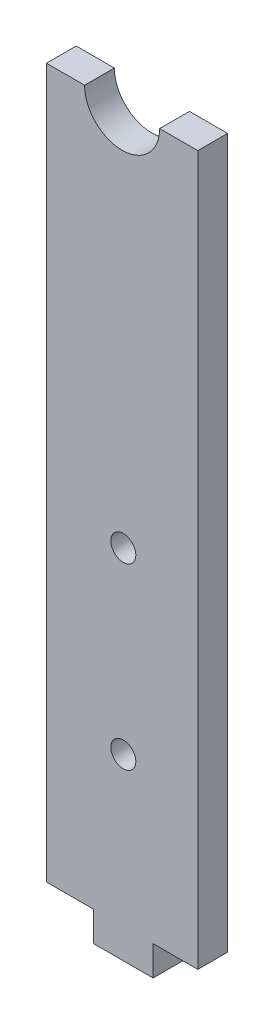
ISO-10303-21;
HEADER;
FILE_DESCRIPTION(('STEP AP214'),'2;1');
FILE_NAME('part.step','',(''),(''),'','','');
FILE_SCHEMA(('AUTOMOTIVE_DESIGN { 1 0 10303 214 1 1 1 1 }'));
ENDSEC;
DATA;
#1=APPLICATION_CONTEXT('core data for automotive mechanical design processes');
#2=APPLICATION_PROTOCOL_DEFINITION('international standard','automotive_design',2000,#1);
#3=PRODUCT_CONTEXT('',#1,'mechanical');
#4=PRODUCT('Part','Part','',(#3));
#5=PRODUCT_RELATED_PRODUCT_CATEGORY('part','',(#4));
#6=PRODUCT_DEFINITION_FORMATION('','',#4);
#7=PRODUCT_DEFINITION_CONTEXT('part definition',#1,'design');
#8=PRODUCT_DEFINITION('design','',#6,#7);
#9=PRODUCT_DEFINITION_SHAPE('','',#8);
#10=(LENGTH_UNIT() NAMED_UNIT(*) SI_UNIT(.MILLI.,.METRE.));
#11=(NAMED_UNIT(*) PLANE_ANGLE_UNIT() SI_UNIT($,.RADIAN.));
#12=(NAMED_UNIT(*) SI_UNIT($,.STERADIAN.) SOLID_ANGLE_UNIT());
#13=UNCERTAINTY_MEASURE_WITH_UNIT(LENGTH_MEASURE(1.E-05),#10,'distance_accuracy_value','');
#14=(GEOMETRIC_REPRESENTATION_CONTEXT(3) GLOBAL_UNCERTAINTY_ASSIGNED_CONTEXT((#13)) GLOBAL_UNIT_ASSIGNED_CONTEXT((#10,
#11,#12)) REPRESENTATION_CONTEXT('',''));
#15=CARTESIAN_POINT('',(0.,0.,0.));
#16=DIRECTION('',(0.,0.,1.));
#17=DIRECTION('',(1.,0.,0.));
#18=AXIS2_PLACEMENT_3D('',#15,#16,#17);
#19=CARTESIAN_POINT('',(-37.6912125425898,13.9321090895539,5.));
#20=DIRECTION('',(0.,-1.,0.));
#21=DIRECTION('',(0.,0.,-1.));
#22=AXIS2_PLACEMENT_3D('',#19,#20,#21);
#23=PLANE('',#22);
#24=DIRECTION('',(-1.,0.,0.));
#25=VECTOR('',#24,1.);
#26=CARTESIAN_POINT('',(-37.6912125425898,13.9321090895539,5.));
#27=LINE('',#26,#25);
#28=CARTESIAN_POINT('',(-31.2912125425898,13.9321090895539,5.));
#29=VERTEX_POINT('',#28);
#30=CARTESIAN_POINT('',(-37.6912125425898,13.9321090895539,5.));
#31=VERTEX_POINT('',#30);
#32=EDGE_CURVE('E134',#29,#31,#27,.T.);
#33=ORIENTED_EDGE('',*,*,#32,.F.);
#34=DIRECTION('',(0.,0.,-1.));
#35=VECTOR('',#34,1.);
#36=CARTESIAN_POINT('',(-31.2912125425898,13.9321090895539,10.));
#37=LINE('',#36,#35);
#38=CARTESIAN_POINT('',(-31.2912125425898,13.9321090895539,0.));
#39=VERTEX_POINT('',#38);
#40=EDGE_CURVE('E121',#29,#39,#37,.T.);
#41=ORIENTED_EDGE('',*,*,#40,.T.);
#42=DIRECTION('',(-1.,0.,0.));
#43=VECTOR('',#42,1.);
#44=CARTESIAN_POINT('',(-37.6912125425898,13.9321090895539,0.));
#45=LINE('',#44,#43);
#46=CARTESIAN_POINT('',(-37.6912125425898,13.9321090895539,0.));
#47=VERTEX_POINT('',#46);
#48=EDGE_CURVE('E132',#39,#47,#45,.T.);
#49=ORIENTED_EDGE('',*,*,#48,.T.);
#50=DIRECTION('',(0.,0.,-1.));
#51=VECTOR('',#50,1.);
#52=CARTESIAN_POINT('',(-37.6912125425898,13.9321090895539,5.));
#53=LINE('',#52,#51);
#54=EDGE_CURVE('E50',#31,#47,#53,.T.);
#55=ORIENTED_EDGE('',*,*,#54,.F.);
#56=EDGE_LOOP('',(#33,#41,#49,#55));
#57=FACE_BOUND('',#56,.T.);
#58=ADVANCED_FACE('F40',(#57),#23,.F.);
#59=CARTESIAN_POINT('',(-37.6912125425898,13.9321090895539,5.));
#60=DIRECTION('',(1.,0.,0.));
#61=DIRECTION('',(0.,1.,0.));
#62=AXIS2_PLACEMENT_3D('',#59,#60,#61);
#63=PLANE('',#62);
#64=DIRECTION('',(0.,-1.,0.));
#65=VECTOR('',#64,1.);
#66=CARTESIAN_POINT('',(-37.6912125425898,13.9321090895539,0.));
#67=LINE('',#66,#65);
#68=CARTESIAN_POINT('',(-37.6912125425898,-105.067890910446,0.));
#69=VERTEX_POINT('',#68);
#70=EDGE_CURVE('E141',#47,#69,#67,.T.);
#71=ORIENTED_EDGE('',*,*,#70,.T.);
#72=DIRECTION('',(0.,0.,-1.));
#73=VECTOR('',#72,1.);
#74=CARTESIAN_POINT('',(-37.6912125425898,-105.067890910446,10.));
#75=LINE('',#74,#73);
#76=CARTESIAN_POINT('',(-37.6912125425898,-105.067890910446,5.));
#77=VERTEX_POINT('',#76);
#78=EDGE_CURVE('E234',#77,#69,#75,.T.);
#79=ORIENTED_EDGE('',*,*,#78,.F.);
#80=DIRECTION('',(0.,-1.,0.));
#81=VECTOR('',#80,1.);
#82=CARTESIAN_POINT('',(-37.6912125425898,13.9321090895539,5.));
#83=LINE('',#82,#81);
#84=EDGE_CURVE('E149',#31,#77,#83,.T.);
#85=ORIENTED_EDGE('',*,*,#84,.F.);
#86=ORIENTED_EDGE('',*,*,#54,.T.);
#87=EDGE_LOOP('',(#71,#79,#85,#86));
#88=FACE_BOUND('',#87,.T.);
#89=ADVANCED_FACE('F42',(#88),#63,.F.);
#90=CARTESIAN_POINT('',(-37.6912125425898,-110.067890910446,5.));
#91=DIRECTION('',(0.,1.,0.));
#92=DIRECTION('',(0.,0.,1.));
#93=AXIS2_PLACEMENT_3D('',#90,#91,#92);
#94=PLANE('',#93);
#95=DIRECTION('',(1.,0.,0.));
#96=VECTOR('',#95,1.);
#97=CARTESIAN_POINT('',(-37.6912125425898,-110.067890910446,0.));
#98=LINE('',#97,#96);
#99=CARTESIAN_POINT('',(-29.7912125425898,-110.067890910446,0.));
#100=VERTEX_POINT('',#99);
#101=CARTESIAN_POINT('',(-19.7912125425898,-110.067890910446,0.));
#102=VERTEX_POINT('',#101);
#103=EDGE_CURVE('E151',#100,#102,#98,.T.);
#104=ORIENTED_EDGE('',*,*,#103,.T.);
#105=DIRECTION('',(0.,0.,-1.));
#106=VECTOR('',#105,1.);
#107=CARTESIAN_POINT('',(-19.7912125425898,-110.067890910446,10.));
#108=LINE('',#107,#106);
#109=CARTESIAN_POINT('',(-19.7912125425898,-110.067890910446,5.));
#110=VERTEX_POINT('',#109);
#111=EDGE_CURVE('E66',#110,#102,#108,.T.);
#112=ORIENTED_EDGE('',*,*,#111,.F.);
#113=DIRECTION('',(1.,0.,0.));
#114=VECTOR('',#113,1.);
#115=CARTESIAN_POINT('',(-37.6912125425898,-110.067890910446,5.));
#116=LINE('',#115,#114);
#117=CARTESIAN_POINT('',(-29.7912125425898,-110.067890910446,5.));
#118=VERTEX_POINT('',#117);
#119=EDGE_CURVE('E181',#118,#110,#116,.T.);
#120=ORIENTED_EDGE('',*,*,#119,.F.);
#121=DIRECTION('',(0.,0.,-1.));
#122=VECTOR('',#121,1.);
#123=CARTESIAN_POINT('',(-29.7912125425898,-110.067890910446,10.));
#124=LINE('',#123,#122);
#125=EDGE_CURVE('E200',#118,#100,#124,.T.);
#126=ORIENTED_EDGE('',*,*,#125,.T.);
#127=EDGE_LOOP('',(#104,#112,#120,#126));
#128=FACE_BOUND('',#127,.T.);
#129=ADVANCED_FACE('F198',(#128),#94,.F.);
#130=CARTESIAN_POINT('',(-12.2912125425898,13.9321090895539,5.));
#131=DIRECTION('',(-1.,0.,0.));
#132=DIRECTION('',(0.,-1.,0.));
#133=AXIS2_PLACEMENT_3D('',#130,#131,#132);
#134=PLANE('',#133);
#135=DIRECTION('',(0.,1.,0.));
#136=VECTOR('',#135,1.);
#137=CARTESIAN_POINT('',(-12.2912125425898,13.9321090895539,5.));
#138=LINE('',#137,#136);
#139=CARTESIAN_POINT('',(-12.2912125425898,-105.067890910446,5.));
#140=VERTEX_POINT('',#139);
#141=CARTESIAN_POINT('',(-12.2912125425898,13.9321090895539,5.));
#142=VERTEX_POINT('',#141);
#143=EDGE_CURVE('E185',#140,#142,#138,.T.);
#144=ORIENTED_EDGE('',*,*,#143,.F.);
#145=DIRECTION('',(0.,0.,-1.));
#146=VECTOR('',#145,1.);
#147=CARTESIAN_POINT('',(-12.2912125425898,-105.067890910446,10.));
#148=LINE('',#147,#146);
#149=CARTESIAN_POINT('',(-12.2912125425898,-105.067890910446,0.));
#150=VERTEX_POINT('',#149);
#151=EDGE_CURVE('E220',#140,#150,#148,.T.);
#152=ORIENTED_EDGE('',*,*,#151,.T.);
#153=DIRECTION('',(0.,1.,0.));
#154=VECTOR('',#153,1.);
#155=CARTESIAN_POINT('',(-12.2912125425898,13.9321090895539,0.));
#156=LINE('',#155,#154);
#157=CARTESIAN_POINT('',(-12.2912125425898,13.9321090895539,0.));
#158=VERTEX_POINT('',#157);
#159=EDGE_CURVE('E144',#150,#158,#156,.T.);
#160=ORIENTED_EDGE('',*,*,#159,.T.);
#161=DIRECTION('',(0.,0.,-1.));
#162=VECTOR('',#161,1.);
#163=CARTESIAN_POINT('',(-12.2912125425898,13.9321090895539,5.));
#164=LINE('',#163,#162);
#165=EDGE_CURVE('E11',#142,#158,#164,.T.);
#166=ORIENTED_EDGE('',*,*,#165,.F.);
#167=EDGE_LOOP('',(#144,#152,#160,#166));
#168=FACE_BOUND('',#167,.T.);
#169=ADVANCED_FACE('F271',(#168),#134,.F.);
#170=CARTESIAN_POINT('',(-18.6912125425898,13.9321090895539,0.));
#171=VERTEX_POINT('',#170);
#172=EDGE_CURVE('E143',#158,#171,#45,.T.);
#173=ORIENTED_EDGE('',*,*,#172,.T.);
#174=DIRECTION('',(0.,0.,-1.));
#175=VECTOR('',#174,1.);
#176=CARTESIAN_POINT('',(-18.6912125425898,13.9321090895539,10.));
#177=LINE('',#176,#175);
#178=CARTESIAN_POINT('',(-18.6912125425898,13.9321090895539,5.));
#179=VERTEX_POINT('',#178);
#180=EDGE_CURVE('E58',#179,#171,#177,.T.);
#181=ORIENTED_EDGE('',*,*,#180,.F.);
#182=EDGE_CURVE('E156',#142,#179,#27,.T.);
#183=ORIENTED_EDGE('',*,*,#182,.F.);
#184=ORIENTED_EDGE('',*,*,#165,.T.);
#185=EDGE_LOOP('',(#173,#181,#183,#184));
#186=FACE_BOUND('',#185,.T.);
#187=ADVANCED_FACE('F268',(#186),#23,.F.);
#188=CARTESIAN_POINT('',(0.,0.,5.));
#189=DIRECTION('',(0.,0.,1.));
#190=DIRECTION('',(1.,0.,0.));
#191=AXIS2_PLACEMENT_3D('',#188,#189,#190);
#192=PLANE('',#191);
#193=CARTESIAN_POINT('',(-24.9912125425898,13.9321090895539,5.));
#194=DIRECTION('',(0.,0.,1.));
#195=DIRECTION('',(1.,0.,0.));
#196=AXIS2_PLACEMENT_3D('',#193,#194,#195);
#197=CIRCLE('',#196,6.3);
#198=EDGE_CURVE('E218',#29,#179,#197,.T.);
#199=ORIENTED_EDGE('',*,*,#198,.F.);
#200=ORIENTED_EDGE('',*,*,#32,.T.);
#201=ORIENTED_EDGE('',*,*,#84,.T.);
#202=DIRECTION('',(-1.,0.,0.));
#203=VECTOR('',#202,1.);
#204=CARTESIAN_POINT('',(0.,-105.067890910446,5.));
#205=LINE('',#204,#203);
#206=CARTESIAN_POINT('',(-29.7912125425898,-105.067890910446,5.));
#207=VERTEX_POINT('',#206);
#208=EDGE_CURVE('E223',#207,#77,#205,.T.);
#209=ORIENTED_EDGE('',*,*,#208,.F.);
#210=DIRECTION('',(0.,1.,0.));
#211=VECTOR('',#210,1.);
#212=CARTESIAN_POINT('',(-29.7912125425898,0.,5.));
#213=LINE('',#212,#211);
#214=EDGE_CURVE('E241',#118,#207,#213,.T.);
#215=ORIENTED_EDGE('',*,*,#214,.F.);
#216=ORIENTED_EDGE('',*,*,#119,.T.);
#217=DIRECTION('',(0.,-1.,0.));
#218=VECTOR('',#217,1.);
#219=CARTESIAN_POINT('',(-19.7912125425898,0.,5.));
#220=LINE('',#219,#218);
#221=CARTESIAN_POINT('',(-19.7912125425898,-105.067890910446,5.));
#222=VERTEX_POINT('',#221);
#223=EDGE_CURVE('E243',#222,#110,#220,.T.);
#224=ORIENTED_EDGE('',*,*,#223,.F.);
#225=DIRECTION('',(-1.,0.,0.));
#226=VECTOR('',#225,1.);
#227=CARTESIAN_POINT('',(0.,-105.067890910446,5.));
#228=LINE('',#227,#226);
#229=EDGE_CURVE('E173',#140,#222,#228,.T.);
#230=ORIENTED_EDGE('',*,*,#229,.F.);
#231=ORIENTED_EDGE('',*,*,#143,.T.);
#232=ORIENTED_EDGE('',*,*,#182,.T.);
#233=EDGE_LOOP('',(#199,#200,#201,#209,#215,#216,#224,#230,#231,#232));
#234=FACE_BOUND('',#233,.T.);
#235=CARTESIAN_POINT('',(-24.7912125425898,-50.0678909104461,5.));
#236=DIRECTION('',(0.,0.,1.));
#237=DIRECTION('',(1.,0.,0.));
#238=AXIS2_PLACEMENT_3D('',#235,#236,#237);
#239=CIRCLE('',#238,2.1);
#240=CARTESIAN_POINT('',(-22.6912125425898,-50.0678909104461,5.));
#241=VERTEX_POINT('',#240);
#242=EDGE_CURVE('E159',#241,#241,#239,.T.);
#243=ORIENTED_EDGE('',*,*,#242,.F.);
#244=EDGE_LOOP('',(#243));
#245=FACE_BOUND('',#244,.T.);
#246=CARTESIAN_POINT('',(-24.7912125425898,-80.0678909104461,5.));
#247=DIRECTION('',(0.,0.,1.));
#248=DIRECTION('',(1.,0.,0.));
#249=AXIS2_PLACEMENT_3D('',#246,#247,#248);
#250=CIRCLE('',#249,2.1);
#251=CARTESIAN_POINT('',(-22.6912125425898,-80.0678909104461,5.));
#252=VERTEX_POINT('',#251);
#253=EDGE_CURVE('E166',#252,#252,#250,.T.);
#254=ORIENTED_EDGE('',*,*,#253,.F.);
#255=EDGE_LOOP('',(#254));
#256=FACE_BOUND('',#255,.T.);
#257=ADVANCED_FACE('F252',(#234,#245,#256),#192,.T.);
#258=CARTESIAN_POINT('',(0.,0.,0.));
#259=DIRECTION('',(0.,0.,1.));
#260=DIRECTION('',(1.,0.,0.));
#261=AXIS2_PLACEMENT_3D('',#258,#259,#260);
#262=PLANE('',#261);
#263=CARTESIAN_POINT('',(-24.7912125425898,-50.0678909104461,0.));
#264=DIRECTION('',(0.,0.,1.));
#265=DIRECTION('',(1.,0.,0.));
#266=AXIS2_PLACEMENT_3D('',#263,#264,#265);
#267=CIRCLE('',#266,2.1);
#268=CARTESIAN_POINT('',(-22.6912125425898,-50.0678909104461,0.));
#269=VERTEX_POINT('',#268);
#270=EDGE_CURVE('E44',#269,#269,#267,.T.);
#271=ORIENTED_EDGE('',*,*,#270,.T.);
#272=EDGE_LOOP('',(#271));
#273=FACE_BOUND('',#272,.T.);
#274=CARTESIAN_POINT('',(-24.7912125425898,-80.0678909104461,0.));
#275=DIRECTION('',(0.,0.,1.));
#276=DIRECTION('',(1.,0.,0.));
#277=AXIS2_PLACEMENT_3D('',#274,#275,#276);
#278=CIRCLE('',#277,2.1);
#279=CARTESIAN_POINT('',(-22.6912125425898,-80.0678909104461,0.));
#280=VERTEX_POINT('',#279);
#281=EDGE_CURVE('E157',#280,#280,#278,.T.);
#282=ORIENTED_EDGE('',*,*,#281,.T.);
#283=EDGE_LOOP('',(#282));
#284=FACE_BOUND('',#283,.T.);
#285=ORIENTED_EDGE('',*,*,#48,.F.);
#286=CARTESIAN_POINT('',(-24.9912125425898,13.9321090895539,0.));
#287=DIRECTION('',(0.,0.,-1.));
#288=DIRECTION('',(1.,0.,0.));
#289=AXIS2_PLACEMENT_3D('',#286,#287,#288);
#290=CIRCLE('',#289,6.3);
#291=EDGE_CURVE('E118',#171,#39,#290,.T.);
#292=ORIENTED_EDGE('',*,*,#291,.F.);
#293=ORIENTED_EDGE('',*,*,#172,.F.);
#294=ORIENTED_EDGE('',*,*,#159,.F.);
#295=DIRECTION('',(1.,0.,0.));
#296=VECTOR('',#295,1.);
#297=CARTESIAN_POINT('',(-12.2912125425898,-105.067890910446,0.));
#298=LINE('',#297,#296);
#299=CARTESIAN_POINT('',(-19.7912125425898,-105.067890910446,0.));
#300=VERTEX_POINT('',#299);
#301=EDGE_CURVE('E206',#300,#150,#298,.T.);
#302=ORIENTED_EDGE('',*,*,#301,.F.);
#303=DIRECTION('',(0.,1.,0.));
#304=VECTOR('',#303,1.);
#305=CARTESIAN_POINT('',(-19.7912125425898,-110.067890910446,0.));
#306=LINE('',#305,#304);
#307=EDGE_CURVE('E204',#102,#300,#306,.T.);
#308=ORIENTED_EDGE('',*,*,#307,.F.);
#309=ORIENTED_EDGE('',*,*,#103,.F.);
#310=DIRECTION('',(0.,-1.,0.));
#311=VECTOR('',#310,1.);
#312=CARTESIAN_POINT('',(-29.7912125425898,-110.067890910446,0.));
#313=LINE('',#312,#311);
#314=CARTESIAN_POINT('',(-29.7912125425898,-105.067890910446,0.));
#315=VERTEX_POINT('',#314);
#316=EDGE_CURVE('E202',#315,#100,#313,.T.);
#317=ORIENTED_EDGE('',*,*,#316,.F.);
#318=DIRECTION('',(1.,0.,0.));
#319=VECTOR('',#318,1.);
#320=CARTESIAN_POINT('',(-37.6912125425898,-105.067890910446,0.));
#321=LINE('',#320,#319);
#322=EDGE_CURVE('E229',#69,#315,#321,.T.);
#323=ORIENTED_EDGE('',*,*,#322,.F.);
#324=ORIENTED_EDGE('',*,*,#70,.F.);
#325=EDGE_LOOP('',(#285,#292,#293,#294,#302,#308,#309,#317,#323,#324));
#326=FACE_BOUND('',#325,.T.);
#327=ADVANCED_FACE('F138',(#273,#284,#326),#262,.F.);
#328=CARTESIAN_POINT('',(-24.7912125425898,-80.0678909104461,-30.));
#329=DIRECTION('',(0.,0.,1.));
#330=DIRECTION('',(1.,0.,0.));
#331=AXIS2_PLACEMENT_3D('',#328,#329,#330);
#332=CYLINDRICAL_SURFACE('',#331,2.1);
#333=ORIENTED_EDGE('',*,*,#253,.T.);
#334=EDGE_LOOP('',(#333));
#335=FACE_BOUND('',#334,.T.);
#336=ORIENTED_EDGE('',*,*,#281,.F.);
#337=EDGE_LOOP('',(#336));
#338=FACE_BOUND('',#337,.T.);
#339=ADVANCED_FACE('F284',(#335,#338),#332,.F.);
#340=CARTESIAN_POINT('',(-24.7912125425898,-50.0678909104461,-30.));
#341=DIRECTION('',(0.,0.,1.));
#342=DIRECTION('',(1.,0.,0.));
#343=AXIS2_PLACEMENT_3D('',#340,#341,#342);
#344=CYLINDRICAL_SURFACE('',#343,2.1);
#345=ORIENTED_EDGE('',*,*,#242,.T.);
#346=EDGE_LOOP('',(#345));
#347=FACE_BOUND('',#346,.T.);
#348=ORIENTED_EDGE('',*,*,#270,.F.);
#349=EDGE_LOOP('',(#348));
#350=FACE_BOUND('',#349,.T.);
#351=ADVANCED_FACE('F290',(#347,#350),#344,.F.);
#352=CARTESIAN_POINT('',(-29.7912125425898,-110.067890910446,10.));
#353=DIRECTION('',(1.,0.,0.));
#354=DIRECTION('',(0.,0.,-1.));
#355=AXIS2_PLACEMENT_3D('',#352,#353,#354);
#356=PLANE('',#355);
#357=ORIENTED_EDGE('',*,*,#214,.T.);
#358=DIRECTION('',(0.,0.,-1.));
#359=VECTOR('',#358,1.);
#360=CARTESIAN_POINT('',(-29.7912125425898,-105.067890910446,10.));
#361=LINE('',#360,#359);
#362=EDGE_CURVE('E215',#207,#315,#361,.T.);
#363=ORIENTED_EDGE('',*,*,#362,.T.);
#364=ORIENTED_EDGE('',*,*,#316,.T.);
#365=ORIENTED_EDGE('',*,*,#125,.F.);
#366=EDGE_LOOP('',(#357,#363,#364,#365));
#367=FACE_BOUND('',#366,.T.);
#368=ADVANCED_FACE('F258',(#367),#356,.F.);
#369=CARTESIAN_POINT('',(-37.6912125425898,-105.067890910446,10.));
#370=DIRECTION('',(0.,1.,0.));
#371=DIRECTION('',(0.,0.,1.));
#372=AXIS2_PLACEMENT_3D('',#369,#370,#371);
#373=PLANE('',#372);
#374=ORIENTED_EDGE('',*,*,#208,.T.);
#375=ORIENTED_EDGE('',*,*,#78,.T.);
#376=ORIENTED_EDGE('',*,*,#322,.T.);
#377=ORIENTED_EDGE('',*,*,#362,.F.);
#378=EDGE_LOOP('',(#374,#375,#376,#377));
#379=FACE_BOUND('',#378,.T.);
#380=ADVANCED_FACE('F260',(#379),#373,.F.);
#381=CARTESIAN_POINT('',(-12.2912125425898,-105.067890910446,10.));
#382=DIRECTION('',(0.,1.,0.));
#383=DIRECTION('',(0.,0.,1.));
#384=AXIS2_PLACEMENT_3D('',#381,#382,#383);
#385=PLANE('',#384);
#386=ORIENTED_EDGE('',*,*,#229,.T.);
#387=DIRECTION('',(0.,0.,-1.));
#388=VECTOR('',#387,1.);
#389=CARTESIAN_POINT('',(-19.7912125425898,-105.067890910446,10.));
#390=LINE('',#389,#388);
#391=EDGE_CURVE('E224',#222,#300,#390,.T.);
#392=ORIENTED_EDGE('',*,*,#391,.T.);
#393=ORIENTED_EDGE('',*,*,#301,.T.);
#394=ORIENTED_EDGE('',*,*,#151,.F.);
#395=EDGE_LOOP('',(#386,#392,#393,#394));
#396=FACE_BOUND('',#395,.T.);
#397=ADVANCED_FACE('F248',(#396),#385,.F.);
#398=CARTESIAN_POINT('',(-19.7912125425898,-110.067890910446,10.));
#399=DIRECTION('',(-1.,0.,0.));
#400=DIRECTION('',(0.,0.,1.));
#401=AXIS2_PLACEMENT_3D('',#398,#399,#400);
#402=PLANE('',#401);
#403=ORIENTED_EDGE('',*,*,#223,.T.);
#404=ORIENTED_EDGE('',*,*,#111,.T.);
#405=ORIENTED_EDGE('',*,*,#307,.T.);
#406=ORIENTED_EDGE('',*,*,#391,.F.);
#407=EDGE_LOOP('',(#403,#404,#405,#406));
#408=FACE_BOUND('',#407,.T.);
#409=ADVANCED_FACE('F251',(#408),#402,.F.);
#410=CARTESIAN_POINT('',(-24.9912125425898,13.9321090895539,10.));
#411=DIRECTION('',(0.,0.,-1.));
#412=DIRECTION('',(-1.,0.,0.));
#413=AXIS2_PLACEMENT_3D('',#410,#411,#412);
#414=CYLINDRICAL_SURFACE('',#413,6.3);
#415=ORIENTED_EDGE('',*,*,#198,.T.);
#416=ORIENTED_EDGE('',*,*,#180,.T.);
#417=ORIENTED_EDGE('',*,*,#291,.T.);
#418=ORIENTED_EDGE('',*,*,#40,.F.);
#419=EDGE_LOOP('',(#415,#416,#417,#418));
#420=FACE_BOUND('',#419,.T.);
#421=ADVANCED_FACE('F120',(#420),#414,.F.);
#422=CLOSED_SHELL('',(#58,#89,#129,#169,#187,#257,#327,#339,#351,#368,#380,#397,#409,#421));
#423=MANIFOLD_SOLID_BREP('B2',#422);
#424=ADVANCED_BREP_SHAPE_REPRESENTATION('',(#18,#423),#14);
#425=SHAPE_DEFINITION_REPRESENTATION(#9,#424);
ENDSEC;
END-ISO-10303-21;
